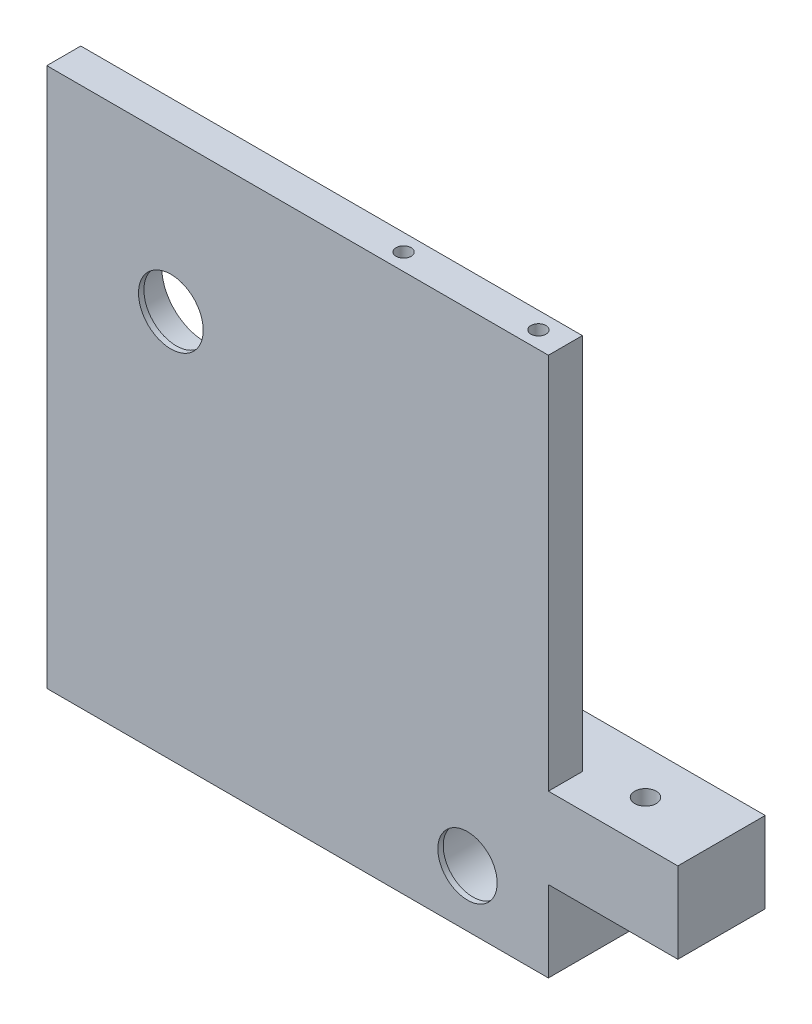
ISO-10303-21;
HEADER;
FILE_DESCRIPTION(('STEP AP214'),'2;1');
FILE_NAME('part.step','',(''),(''),'','','');
FILE_SCHEMA(('AUTOMOTIVE_DESIGN { 1 0 10303 214 1 1 1 1 }'));
ENDSEC;
DATA;
#1=APPLICATION_CONTEXT('core data for automotive mechanical design processes');
#2=APPLICATION_PROTOCOL_DEFINITION('international standard','automotive_design',2000,#1);
#3=PRODUCT_CONTEXT('',#1,'mechanical');
#4=PRODUCT('Part','Part','',(#3));
#5=PRODUCT_RELATED_PRODUCT_CATEGORY('part','',(#4));
#6=PRODUCT_DEFINITION_FORMATION('','',#4);
#7=PRODUCT_DEFINITION_CONTEXT('part definition',#1,'design');
#8=PRODUCT_DEFINITION('design','',#6,#7);
#9=PRODUCT_DEFINITION_SHAPE('','',#8);
#10=(LENGTH_UNIT() NAMED_UNIT(*) SI_UNIT(.MILLI.,.METRE.));
#11=(NAMED_UNIT(*) PLANE_ANGLE_UNIT() SI_UNIT($,.RADIAN.));
#12=(NAMED_UNIT(*) SI_UNIT($,.STERADIAN.) SOLID_ANGLE_UNIT());
#13=UNCERTAINTY_MEASURE_WITH_UNIT(LENGTH_MEASURE(1.E-05),#10,'distance_accuracy_value','');
#14=(GEOMETRIC_REPRESENTATION_CONTEXT(3) GLOBAL_UNCERTAINTY_ASSIGNED_CONTEXT((#13)) GLOBAL_UNIT_ASSIGNED_CONTEXT((#10,
#11,#12)) REPRESENTATION_CONTEXT('',''));
#15=CARTESIAN_POINT('',(0.,0.,0.));
#16=DIRECTION('',(0.,0.,1.));
#17=DIRECTION('',(1.,0.,0.));
#18=AXIS2_PLACEMENT_3D('',#15,#16,#17);
#19=CARTESIAN_POINT('',(1.81294964028777,-24.5719424460432,40.1));
#20=DIRECTION('',(0.,0.,-1.));
#21=DIRECTION('',(-1.,0.,0.));
#22=AXIS2_PLACEMENT_3D('',#19,#20,#21);
#23=CYLINDRICAL_SURFACE('',#22,7.5);
#24=CARTESIAN_POINT('',(1.81294964028777,-24.5719424460432,-9.9));
#25=DIRECTION('',(0.,0.,-1.));
#26=DIRECTION('',(-1.,0.,0.));
#27=AXIS2_PLACEMENT_3D('',#24,#25,#26);
#28=CIRCLE('',#27,7.5);
#29=CARTESIAN_POINT('',(-5.68705035971223,-24.5719424460432,-9.9));
#30=VERTEX_POINT('',#29);
#31=EDGE_CURVE('E305',#30,#30,#28,.T.);
#32=ORIENTED_EDGE('',*,*,#31,.T.);
#33=EDGE_LOOP('',(#32));
#34=FACE_BOUND('',#33,.T.);
#35=CARTESIAN_POINT('',(1.81294964028777,-24.5719424460432,5.3));
#36=DIRECTION('',(0.,0.,1.));
#37=DIRECTION('',(1.,0.,0.));
#38=AXIS2_PLACEMENT_3D('',#35,#36,#37);
#39=CIRCLE('',#38,7.5);
#40=CARTESIAN_POINT('',(9.31294964028777,-24.5719424460432,5.3));
#41=VERTEX_POINT('',#40);
#42=EDGE_CURVE('E14',#41,#41,#39,.F.);
#43=ORIENTED_EDGE('',*,*,#42,.F.);
#44=EDGE_LOOP('',(#43));
#45=FACE_BOUND('',#44,.T.);
#46=ADVANCED_FACE('F62',(#34,#45),#23,.F.);
#47=CARTESIAN_POINT('',(-53.1870503597122,36.9280575539568,50.));
#48=DIRECTION('',(0.,0.,-1.));
#49=DIRECTION('',(-1.,0.,0.));
#50=AXIS2_PLACEMENT_3D('',#47,#48,#49);
#51=CYLINDRICAL_SURFACE('',#50,8.);
#52=CARTESIAN_POINT('',(-53.1870503597122,36.9280575539568,0.));
#53=DIRECTION('',(0.,0.,-1.));
#54=DIRECTION('',(-1.,0.,0.));
#55=AXIS2_PLACEMENT_3D('',#52,#53,#54);
#56=CIRCLE('',#55,8.);
#57=CARTESIAN_POINT('',(-61.1870503597122,36.9280575539568,0.));
#58=VERTEX_POINT('',#57);
#59=EDGE_CURVE('E310',#58,#58,#56,.T.);
#60=ORIENTED_EDGE('',*,*,#59,.T.);
#61=EDGE_LOOP('',(#60));
#62=FACE_BOUND('',#61,.T.);
#63=CARTESIAN_POINT('',(-53.1870503597122,36.9280575539568,5.3));
#64=DIRECTION('',(0.,0.,1.));
#65=DIRECTION('',(1.,0.,0.));
#66=AXIS2_PLACEMENT_3D('',#63,#64,#65);
#67=CIRCLE('',#66,8.);
#68=CARTESIAN_POINT('',(-45.1870503597122,36.9280575539568,5.3));
#69=VERTEX_POINT('',#68);
#70=EDGE_CURVE('E70',#69,#69,#67,.F.);
#71=ORIENTED_EDGE('',*,*,#70,.F.);
#72=EDGE_LOOP('',(#71));
#73=FACE_BOUND('',#72,.T.);
#74=ADVANCED_FACE('F208',(#62,#73),#51,.F.);
#75=CARTESIAN_POINT('',(16.8129496402878,64.9280575539568,6.3));
#76=DIRECTION('',(1.,0.,0.));
#77=DIRECTION('',(0.,1.,0.));
#78=AXIS2_PLACEMENT_3D('',#75,#76,#77);
#79=PLANE('',#78);
#80=DIRECTION('',(0.,-1.,0.));
#81=VECTOR('',#80,1.);
#82=CARTESIAN_POINT('',(16.8129496402878,64.9280575539568,0.));
#83=LINE('',#82,#81);
#84=CARTESIAN_POINT('',(16.8129496402878,64.9280575539568,0.));
#85=VERTEX_POINT('',#84);
#86=CARTESIAN_POINT('',(16.8129496402878,-5.07194244604315,0.));
#87=VERTEX_POINT('',#86);
#88=EDGE_CURVE('E77',#85,#87,#83,.T.);
#89=ORIENTED_EDGE('',*,*,#88,.F.);
#90=DIRECTION('',(0.,0.,-1.));
#91=VECTOR('',#90,1.);
#92=CARTESIAN_POINT('',(16.8129496402878,64.9280575539568,6.3));
#93=LINE('',#92,#91);
#94=CARTESIAN_POINT('',(16.8129496402878,64.9280575539568,6.3));
#95=VERTEX_POINT('',#94);
#96=EDGE_CURVE('E195',#95,#85,#93,.T.);
#97=ORIENTED_EDGE('',*,*,#96,.F.);
#98=DIRECTION('',(0.,-1.,0.));
#99=VECTOR('',#98,1.);
#100=CARTESIAN_POINT('',(16.8129496402878,64.9280575539568,6.3));
#101=LINE('',#100,#99);
#102=CARTESIAN_POINT('',(16.8129496402878,-5.07194244604316,6.3));
#103=VERTEX_POINT('',#102);
#104=EDGE_CURVE('E182',#95,#103,#101,.T.);
#105=ORIENTED_EDGE('',*,*,#104,.T.);
#106=DIRECTION('',(0.,0.,1.));
#107=VECTOR('',#106,1.);
#108=CARTESIAN_POINT('',(16.8129496402878,-5.07194244604315,6.3));
#109=LINE('',#108,#107);
#110=EDGE_CURVE('E287',#87,#103,#109,.T.);
#111=ORIENTED_EDGE('',*,*,#110,.F.);
#112=EDGE_LOOP('',(#89,#97,#105,#111));
#113=FACE_BOUND('',#112,.T.);
#114=ADVANCED_FACE('F210',(#113),#79,.T.);
#115=CARTESIAN_POINT('',(0.,0.,0.));
#116=DIRECTION('',(0.,0.,1.));
#117=DIRECTION('',(1.,0.,0.));
#118=AXIS2_PLACEMENT_3D('',#115,#116,#117);
#119=PLANE('',#118);
#120=ORIENTED_EDGE('',*,*,#59,.F.);
#121=EDGE_LOOP('',(#120));
#122=FACE_BOUND('',#121,.T.);
#123=DIRECTION('',(0.,1.,0.));
#124=VECTOR('',#123,1.);
#125=CARTESIAN_POINT('',(-23.1870503597122,64.9280575539568,0.));
#126=LINE('',#125,#124);
#127=CARTESIAN_POINT('',(-23.1870503597123,-35.0719424460432,0.));
#128=VERTEX_POINT('',#127);
#129=CARTESIAN_POINT('',(-23.1870503597123,-5.07194244604315,0.));
#130=VERTEX_POINT('',#129);
#131=EDGE_CURVE('E152',#128,#130,#126,.T.);
#132=ORIENTED_EDGE('',*,*,#131,.F.);
#133=DIRECTION('',(1.,0.,0.));
#134=VECTOR('',#133,1.);
#135=CARTESIAN_POINT('',(-76.1870503597122,-35.0719424460432,0.));
#136=LINE('',#135,#134);
#137=CARTESIAN_POINT('',(-76.1870503597122,-35.0719424460432,0.));
#138=VERTEX_POINT('',#137);
#139=EDGE_CURVE('E191',#138,#128,#136,.T.);
#140=ORIENTED_EDGE('',*,*,#139,.F.);
#141=DIRECTION('',(0.,-1.,0.));
#142=VECTOR('',#141,1.);
#143=CARTESIAN_POINT('',(-76.1870503597122,64.9280575539568,0.));
#144=LINE('',#143,#142);
#145=CARTESIAN_POINT('',(-76.1870503597122,64.9280575539568,0.));
#146=VERTEX_POINT('',#145);
#147=EDGE_CURVE('E173',#146,#138,#144,.T.);
#148=ORIENTED_EDGE('',*,*,#147,.F.);
#149=DIRECTION('',(1.,0.,0.));
#150=VECTOR('',#149,1.);
#151=CARTESIAN_POINT('',(-76.1870503597122,64.9280575539568,0.));
#152=LINE('',#151,#150);
#153=EDGE_CURVE('E178',#146,#85,#152,.T.);
#154=ORIENTED_EDGE('',*,*,#153,.T.);
#155=ORIENTED_EDGE('',*,*,#88,.T.);
#156=DIRECTION('',(-1.,0.,0.));
#157=VECTOR('',#156,1.);
#158=CARTESIAN_POINT('',(16.8129496402878,-5.07194244604316,0.));
#159=LINE('',#158,#157);
#160=EDGE_CURVE('E141',#87,#130,#159,.T.);
#161=ORIENTED_EDGE('',*,*,#160,.T.);
#162=EDGE_LOOP('',(#132,#140,#148,#154,#155,#161));
#163=FACE_BOUND('',#162,.T.);
#164=ADVANCED_FACE('F151',(#122,#163),#119,.F.);
#165=CARTESIAN_POINT('',(-76.1870503597122,64.9280575539568,6.3));
#166=DIRECTION('',(1.,0.,0.));
#167=DIRECTION('',(0.,0.,-1.));
#168=AXIS2_PLACEMENT_3D('',#165,#166,#167);
#169=PLANE('',#168);
#170=ORIENTED_EDGE('',*,*,#147,.T.);
#171=DIRECTION('',(0.,0.,-1.));
#172=VECTOR('',#171,1.);
#173=CARTESIAN_POINT('',(-76.1870503597122,-35.0719424460432,6.3));
#174=LINE('',#173,#172);
#175=CARTESIAN_POINT('',(-76.1870503597122,-35.0719424460432,6.3));
#176=VERTEX_POINT('',#175);
#177=EDGE_CURVE('E201',#176,#138,#174,.T.);
#178=ORIENTED_EDGE('',*,*,#177,.F.);
#179=DIRECTION('',(0.,-1.,0.));
#180=VECTOR('',#179,1.);
#181=CARTESIAN_POINT('',(-76.1870503597122,64.9280575539568,6.3));
#182=LINE('',#181,#180);
#183=CARTESIAN_POINT('',(-76.1870503597122,64.9280575539568,6.3));
#184=VERTEX_POINT('',#183);
#185=EDGE_CURVE('E174',#184,#176,#182,.T.);
#186=ORIENTED_EDGE('',*,*,#185,.F.);
#187=DIRECTION('',(0.,0.,-1.));
#188=VECTOR('',#187,1.);
#189=CARTESIAN_POINT('',(-76.1870503597122,64.9280575539568,6.3));
#190=LINE('',#189,#188);
#191=EDGE_CURVE('E188',#184,#146,#190,.T.);
#192=ORIENTED_EDGE('',*,*,#191,.T.);
#193=EDGE_LOOP('',(#170,#178,#186,#192));
#194=FACE_BOUND('',#193,.T.);
#195=ADVANCED_FACE('F64',(#194),#169,.F.);
#196=CARTESIAN_POINT('',(-76.1870503597122,-35.0719424460432,6.3));
#197=DIRECTION('',(0.,1.,0.));
#198=DIRECTION('',(0.,0.,1.));
#199=AXIS2_PLACEMENT_3D('',#196,#197,#198);
#200=PLANE('',#199);
#201=ORIENTED_EDGE('',*,*,#139,.T.);
#202=DIRECTION('',(0.,0.,1.));
#203=VECTOR('',#202,1.);
#204=CARTESIAN_POINT('',(-23.1870503597123,-35.0719424460432,-9.9));
#205=LINE('',#204,#203);
#206=CARTESIAN_POINT('',(-23.1870503597123,-35.0719424460432,-9.9));
#207=VERTEX_POINT('',#206);
#208=EDGE_CURVE('E159',#207,#128,#205,.T.);
#209=ORIENTED_EDGE('',*,*,#208,.F.);
#210=DIRECTION('',(-1.,0.,0.));
#211=VECTOR('',#210,1.);
#212=CARTESIAN_POINT('',(16.8129496402877,-35.0719424460432,-9.9));
#213=LINE('',#212,#211);
#214=CARTESIAN_POINT('',(16.8129496402877,-35.0719424460432,-9.9));
#215=VERTEX_POINT('',#214);
#216=EDGE_CURVE('E163',#215,#207,#213,.T.);
#217=ORIENTED_EDGE('',*,*,#216,.F.);
#218=DIRECTION('',(0.,0.,-1.));
#219=VECTOR('',#218,1.);
#220=CARTESIAN_POINT('',(16.8129496402878,-35.0719424460432,6.3));
#221=LINE('',#220,#219);
#222=CARTESIAN_POINT('',(16.8129496402878,-35.0719424460432,6.3));
#223=VERTEX_POINT('',#222);
#224=EDGE_CURVE('E198',#223,#215,#221,.T.);
#225=ORIENTED_EDGE('',*,*,#224,.F.);
#226=DIRECTION('',(1.,0.,0.));
#227=VECTOR('',#226,1.);
#228=CARTESIAN_POINT('',(-76.1870503597122,-35.0719424460432,6.3));
#229=LINE('',#228,#227);
#230=EDGE_CURVE('E177',#176,#223,#229,.T.);
#231=ORIENTED_EDGE('',*,*,#230,.F.);
#232=ORIENTED_EDGE('',*,*,#177,.T.);
#233=EDGE_LOOP('',(#201,#209,#217,#225,#231,#232));
#234=FACE_BOUND('',#233,.T.);
#235=ADVANCED_FACE('F258',(#234),#200,.F.);
#236=DIRECTION('',(0.,0.,-1.));
#237=VECTOR('',#236,1.);
#238=CARTESIAN_POINT('',(16.8129496402878,-20.0719424460432,6.3));
#239=LINE('',#238,#237);
#240=CARTESIAN_POINT('',(16.8129496402878,-20.0719424460432,6.3));
#241=VERTEX_POINT('',#240);
#242=CARTESIAN_POINT('',(16.8129496402878,-20.0719424460432,-9.9));
#243=VERTEX_POINT('',#242);
#244=EDGE_CURVE('E85',#241,#243,#239,.T.);
#245=ORIENTED_EDGE('',*,*,#244,.F.);
#246=EDGE_CURVE('E181',#241,#223,#101,.T.);
#247=ORIENTED_EDGE('',*,*,#246,.T.);
#248=ORIENTED_EDGE('',*,*,#224,.T.);
#249=DIRECTION('',(0.,-1.,0.));
#250=VECTOR('',#249,1.);
#251=CARTESIAN_POINT('',(16.8129496402878,64.9280575539568,-9.9));
#252=LINE('',#251,#250);
#253=EDGE_CURVE('E160',#243,#215,#252,.T.);
#254=ORIENTED_EDGE('',*,*,#253,.F.);
#255=EDGE_LOOP('',(#245,#247,#248,#254));
#256=FACE_BOUND('',#255,.T.);
#257=ADVANCED_FACE('F219',(#256),#79,.T.);
#258=CARTESIAN_POINT('',(-76.1870503597122,64.9280575539568,6.3));
#259=DIRECTION('',(0.,1.,0.));
#260=DIRECTION('',(0.,0.,1.));
#261=AXIS2_PLACEMENT_3D('',#258,#259,#260);
#262=PLANE('',#261);
#263=CARTESIAN_POINT('',(11.8129496402878,64.9280575539568,3.15));
#264=DIRECTION('',(0.,1.,0.));
#265=DIRECTION('',(0.,0.,1.));
#266=AXIS2_PLACEMENT_3D('',#263,#264,#265);
#267=CIRCLE('',#266,1.4);
#268=CARTESIAN_POINT('',(11.8129496402878,64.9280575539568,4.55));
#269=VERTEX_POINT('',#268);
#270=EDGE_CURVE('E331',#269,#269,#267,.T.);
#271=ORIENTED_EDGE('',*,*,#270,.F.);
#272=EDGE_LOOP('',(#271));
#273=FACE_BOUND('',#272,.T.);
#274=CARTESIAN_POINT('',(-13.1870503597122,64.9280575539568,3.15));
#275=DIRECTION('',(0.,1.,0.));
#276=DIRECTION('',(0.,0.,1.));
#277=AXIS2_PLACEMENT_3D('',#274,#275,#276);
#278=CIRCLE('',#277,1.4);
#279=CARTESIAN_POINT('',(-13.1870503597122,64.9280575539568,4.55));
#280=VERTEX_POINT('',#279);
#281=EDGE_CURVE('E325',#280,#280,#278,.T.);
#282=ORIENTED_EDGE('',*,*,#281,.F.);
#283=EDGE_LOOP('',(#282));
#284=FACE_BOUND('',#283,.T.);
#285=ORIENTED_EDGE('',*,*,#96,.T.);
#286=ORIENTED_EDGE('',*,*,#153,.F.);
#287=ORIENTED_EDGE('',*,*,#191,.F.);
#288=DIRECTION('',(1.,0.,0.));
#289=VECTOR('',#288,1.);
#290=CARTESIAN_POINT('',(-76.1870503597122,64.9280575539568,6.3));
#291=LINE('',#290,#289);
#292=EDGE_CURVE('E185',#184,#95,#291,.T.);
#293=ORIENTED_EDGE('',*,*,#292,.T.);
#294=EDGE_LOOP('',(#285,#286,#287,#293));
#295=FACE_BOUND('',#294,.T.);
#296=ADVANCED_FACE('F250',(#273,#284,#295),#262,.T.);
#297=CARTESIAN_POINT('',(0.,0.,6.3));
#298=DIRECTION('',(0.,0.,1.));
#299=DIRECTION('',(1.,0.,0.));
#300=AXIS2_PLACEMENT_3D('',#297,#298,#299);
#301=PLANE('',#300);
#302=ORIENTED_EDGE('',*,*,#185,.T.);
#303=ORIENTED_EDGE('',*,*,#230,.T.);
#304=ORIENTED_EDGE('',*,*,#246,.F.);
#305=DIRECTION('',(-1.,0.,0.));
#306=VECTOR('',#305,1.);
#307=CARTESIAN_POINT('',(40.8129496402878,-20.0719424460432,6.3));
#308=LINE('',#307,#306);
#309=CARTESIAN_POINT('',(40.8129496402878,-20.0719424460432,6.3));
#310=VERTEX_POINT('',#309);
#311=EDGE_CURVE('E161',#310,#241,#308,.T.);
#312=ORIENTED_EDGE('',*,*,#311,.F.);
#313=DIRECTION('',(0.,-1.,0.));
#314=VECTOR('',#313,1.);
#315=CARTESIAN_POINT('',(40.8129496402878,-5.07194244604315,6.3));
#316=LINE('',#315,#314);
#317=CARTESIAN_POINT('',(40.8129496402878,-5.07194244604315,6.3));
#318=VERTEX_POINT('',#317);
#319=EDGE_CURVE('E280',#318,#310,#316,.T.);
#320=ORIENTED_EDGE('',*,*,#319,.F.);
#321=DIRECTION('',(-1.,0.,0.));
#322=VECTOR('',#321,1.);
#323=CARTESIAN_POINT('',(40.8129496402878,-5.07194244604315,6.3));
#324=LINE('',#323,#322);
#325=EDGE_CURVE('E277',#318,#103,#324,.T.);
#326=ORIENTED_EDGE('',*,*,#325,.T.);
#327=ORIENTED_EDGE('',*,*,#104,.F.);
#328=ORIENTED_EDGE('',*,*,#292,.F.);
#329=EDGE_LOOP('',(#302,#303,#304,#312,#320,#326,#327,#328));
#330=FACE_BOUND('',#329,.T.);
#331=CARTESIAN_POINT('',(-53.1870503597122,36.9280575539568,6.3));
#332=DIRECTION('',(0.,0.,1.));
#333=DIRECTION('',(1.,0.,0.));
#334=AXIS2_PLACEMENT_3D('',#331,#332,#333);
#335=CIRCLE('',#334,6.);
#336=CARTESIAN_POINT('',(-47.1870503597122,36.9280575539568,6.3));
#337=VERTEX_POINT('',#336);
#338=EDGE_CURVE('E313',#337,#337,#335,.T.);
#339=ORIENTED_EDGE('',*,*,#338,.F.);
#340=EDGE_LOOP('',(#339));
#341=FACE_BOUND('',#340,.T.);
#342=CARTESIAN_POINT('',(1.81294964028777,-24.5719424460432,6.3));
#343=DIRECTION('',(0.,0.,1.));
#344=DIRECTION('',(1.,0.,0.));
#345=AXIS2_PLACEMENT_3D('',#342,#343,#344);
#346=CIRCLE('',#345,5.5);
#347=CARTESIAN_POINT('',(7.31294964028777,-24.5719424460432,6.3));
#348=VERTEX_POINT('',#347);
#349=EDGE_CURVE('E319',#348,#348,#346,.T.);
#350=ORIENTED_EDGE('',*,*,#349,.F.);
#351=EDGE_LOOP('',(#350));
#352=FACE_BOUND('',#351,.T.);
#353=ADVANCED_FACE('F247',(#330,#341,#352),#301,.T.);
#354=CARTESIAN_POINT('',(-23.1870503597122,64.9280575539568,-9.9));
#355=DIRECTION('',(1.,0.,0.));
#356=DIRECTION('',(0.,1.,0.));
#357=AXIS2_PLACEMENT_3D('',#354,#355,#356);
#358=PLANE('',#357);
#359=ORIENTED_EDGE('',*,*,#131,.T.);
#360=DIRECTION('',(0.,0.,-1.));
#361=VECTOR('',#360,1.);
#362=CARTESIAN_POINT('',(-23.1870503597123,-5.07194244604315,80.6225774829855));
#363=LINE('',#362,#361);
#364=CARTESIAN_POINT('',(-23.1870503597123,-5.07194244604315,-9.9));
#365=VERTEX_POINT('',#364);
#366=EDGE_CURVE('E139',#130,#365,#363,.T.);
#367=ORIENTED_EDGE('',*,*,#366,.T.);
#368=DIRECTION('',(0.,1.,0.));
#369=VECTOR('',#368,1.);
#370=CARTESIAN_POINT('',(-23.1870503597122,64.9280575539568,-9.9));
#371=LINE('',#370,#369);
#372=EDGE_CURVE('E170',#207,#365,#371,.T.);
#373=ORIENTED_EDGE('',*,*,#372,.F.);
#374=ORIENTED_EDGE('',*,*,#208,.T.);
#375=EDGE_LOOP('',(#359,#367,#373,#374));
#376=FACE_BOUND('',#375,.T.);
#377=ADVANCED_FACE('F157',(#376),#358,.F.);
#378=CARTESIAN_POINT('',(0.,0.,-9.9));
#379=DIRECTION('',(0.,0.,-1.));
#380=DIRECTION('',(-1.,0.,0.));
#381=AXIS2_PLACEMENT_3D('',#378,#379,#380);
#382=PLANE('',#381);
#383=ORIENTED_EDGE('',*,*,#372,.T.);
#384=DIRECTION('',(-1.,0.,0.));
#385=VECTOR('',#384,1.);
#386=CARTESIAN_POINT('',(40.8129496402878,-5.07194244604315,-9.9));
#387=LINE('',#386,#385);
#388=CARTESIAN_POINT('',(40.8129496402878,-5.07194244604315,-9.9));
#389=VERTEX_POINT('',#388);
#390=EDGE_CURVE('E145',#389,#365,#387,.T.);
#391=ORIENTED_EDGE('',*,*,#390,.F.);
#392=DIRECTION('',(0.,1.,0.));
#393=VECTOR('',#392,1.);
#394=CARTESIAN_POINT('',(40.8129496402878,-5.07194244604315,-9.9));
#395=LINE('',#394,#393);
#396=CARTESIAN_POINT('',(40.8129496402878,-20.0719424460432,-9.9));
#397=VERTEX_POINT('',#396);
#398=EDGE_CURVE('E284',#397,#389,#395,.T.);
#399=ORIENTED_EDGE('',*,*,#398,.F.);
#400=DIRECTION('',(-1.,0.,0.));
#401=VECTOR('',#400,1.);
#402=CARTESIAN_POINT('',(40.8129496402878,-20.0719424460432,-9.9));
#403=LINE('',#402,#401);
#404=EDGE_CURVE('E166',#397,#243,#403,.T.);
#405=ORIENTED_EDGE('',*,*,#404,.T.);
#406=ORIENTED_EDGE('',*,*,#253,.T.);
#407=ORIENTED_EDGE('',*,*,#216,.T.);
#408=EDGE_LOOP('',(#383,#391,#399,#405,#406,#407));
#409=FACE_BOUND('',#408,.T.);
#410=ORIENTED_EDGE('',*,*,#31,.F.);
#411=EDGE_LOOP('',(#410));
#412=FACE_BOUND('',#411,.T.);
#413=ADVANCED_FACE('F240',(#409,#412),#382,.T.);
#414=CARTESIAN_POINT('',(40.8129496402878,-20.0719424460432,6.3));
#415=DIRECTION('',(0.,1.,0.));
#416=DIRECTION('',(-1.,0.,0.));
#417=AXIS2_PLACEMENT_3D('',#414,#415,#416);
#418=PLANE('',#417);
#419=CARTESIAN_POINT('',(26.8129496402877,-20.0719424460432,-1.7));
#420=DIRECTION('',(0.,1.,0.));
#421=DIRECTION('',(-1.,0.,0.));
#422=AXIS2_PLACEMENT_3D('',#419,#420,#421);
#423=CIRCLE('',#422,2.);
#424=CARTESIAN_POINT('',(24.8129496402878,-20.0719424460432,-1.7));
#425=VERTEX_POINT('',#424);
#426=EDGE_CURVE('E298',#425,#425,#423,.T.);
#427=ORIENTED_EDGE('',*,*,#426,.T.);
#428=EDGE_LOOP('',(#427));
#429=FACE_BOUND('',#428,.T.);
#430=ORIENTED_EDGE('',*,*,#244,.T.);
#431=ORIENTED_EDGE('',*,*,#404,.F.);
#432=DIRECTION('',(0.,0.,-1.));
#433=VECTOR('',#432,1.);
#434=CARTESIAN_POINT('',(40.8129496402878,-20.0719424460432,6.3));
#435=LINE('',#434,#433);
#436=EDGE_CURVE('E293',#310,#397,#435,.T.);
#437=ORIENTED_EDGE('',*,*,#436,.F.);
#438=ORIENTED_EDGE('',*,*,#311,.T.);
#439=EDGE_LOOP('',(#430,#431,#437,#438));
#440=FACE_BOUND('',#439,.T.);
#441=ADVANCED_FACE('F236',(#429,#440),#418,.F.);
#442=CARTESIAN_POINT('',(40.8129496402878,-5.07194244604315,6.3));
#443=DIRECTION('',(0.,-1.,0.));
#444=DIRECTION('',(1.,0.,0.));
#445=AXIS2_PLACEMENT_3D('',#442,#443,#444);
#446=PLANE('',#445);
#447=CARTESIAN_POINT('',(26.8129496402877,-5.07194244604315,-1.7));
#448=DIRECTION('',(0.,1.,0.));
#449=DIRECTION('',(-1.,0.,0.));
#450=AXIS2_PLACEMENT_3D('',#447,#448,#449);
#451=CIRCLE('',#450,2.);
#452=CARTESIAN_POINT('',(24.8129496402878,-5.07194244604315,-1.7));
#453=VERTEX_POINT('',#452);
#454=EDGE_CURVE('E301',#453,#453,#451,.T.);
#455=ORIENTED_EDGE('',*,*,#454,.F.);
#456=EDGE_LOOP('',(#455));
#457=FACE_BOUND('',#456,.T.);
#458=ORIENTED_EDGE('',*,*,#390,.T.);
#459=ORIENTED_EDGE('',*,*,#366,.F.);
#460=ORIENTED_EDGE('',*,*,#160,.F.);
#461=ORIENTED_EDGE('',*,*,#110,.T.);
#462=ORIENTED_EDGE('',*,*,#325,.F.);
#463=DIRECTION('',(0.,0.,1.));
#464=VECTOR('',#463,1.);
#465=CARTESIAN_POINT('',(40.8129496402878,-5.07194244604315,6.3));
#466=LINE('',#465,#464);
#467=EDGE_CURVE('E281',#389,#318,#466,.T.);
#468=ORIENTED_EDGE('',*,*,#467,.F.);
#469=EDGE_LOOP('',(#458,#459,#460,#461,#462,#468));
#470=FACE_BOUND('',#469,.T.);
#471=ADVANCED_FACE('F140',(#457,#470),#446,.F.);
#472=CARTESIAN_POINT('',(40.8129496402878,0.,0.));
#473=DIRECTION('',(1.,0.,0.));
#474=DIRECTION('',(0.,0.,-1.));
#475=AXIS2_PLACEMENT_3D('',#472,#473,#474);
#476=PLANE('',#475);
#477=ORIENTED_EDGE('',*,*,#319,.T.);
#478=ORIENTED_EDGE('',*,*,#436,.T.);
#479=ORIENTED_EDGE('',*,*,#398,.T.);
#480=ORIENTED_EDGE('',*,*,#467,.T.);
#481=EDGE_LOOP('',(#477,#478,#479,#480));
#482=FACE_BOUND('',#481,.T.);
#483=ADVANCED_FACE('F229',(#482),#476,.T.);
#484=CARTESIAN_POINT('',(26.8129496402878,-55.0719424460432,-1.7));
#485=DIRECTION('',(0.,1.,0.));
#486=DIRECTION('',(-1.,0.,0.));
#487=AXIS2_PLACEMENT_3D('',#484,#485,#486);
#488=CYLINDRICAL_SURFACE('',#487,2.);
#489=ORIENTED_EDGE('',*,*,#454,.T.);
#490=EDGE_LOOP('',(#489));
#491=FACE_BOUND('',#490,.T.);
#492=ORIENTED_EDGE('',*,*,#426,.F.);
#493=EDGE_LOOP('',(#492));
#494=FACE_BOUND('',#493,.T.);
#495=ADVANCED_FACE('F226',(#491,#494),#488,.F.);
#496=CARTESIAN_POINT('',(-53.1870503597122,36.9280575539568,5.3));
#497=DIRECTION('',(0.,0.,1.));
#498=DIRECTION('',(1.,0.,0.));
#499=AXIS2_PLACEMENT_3D('',#496,#497,#498);
#500=PLANE('',#499);
#501=CARTESIAN_POINT('',(-53.1870503597122,36.9280575539568,5.3));
#502=DIRECTION('',(0.,0.,1.));
#503=DIRECTION('',(1.,0.,0.));
#504=AXIS2_PLACEMENT_3D('',#501,#502,#503);
#505=CIRCLE('',#504,6.);
#506=CARTESIAN_POINT('',(-47.1870503597122,36.9280575539568,5.3));
#507=VERTEX_POINT('',#506);
#508=EDGE_CURVE('E312',#507,#507,#505,.T.);
#509=ORIENTED_EDGE('',*,*,#508,.T.);
#510=EDGE_LOOP('',(#509));
#511=FACE_BOUND('',#510,.T.);
#512=ORIENTED_EDGE('',*,*,#70,.T.);
#513=EDGE_LOOP('',(#512));
#514=FACE_BOUND('',#513,.T.);
#515=ADVANCED_FACE('F206',(#511,#514),#500,.F.);
#516=CARTESIAN_POINT('',(-53.1870503597122,36.9280575539568,5.3));
#517=DIRECTION('',(0.,0.,1.));
#518=DIRECTION('',(1.,0.,0.));
#519=AXIS2_PLACEMENT_3D('',#516,#517,#518);
#520=CYLINDRICAL_SURFACE('',#519,6.);
#521=ORIENTED_EDGE('',*,*,#508,.F.);
#522=EDGE_LOOP('',(#521));
#523=FACE_BOUND('',#522,.T.);
#524=ORIENTED_EDGE('',*,*,#338,.T.);
#525=EDGE_LOOP('',(#524));
#526=FACE_BOUND('',#525,.T.);
#527=ADVANCED_FACE('F365',(#523,#526),#520,.F.);
#528=CARTESIAN_POINT('',(1.81294964028777,-24.5719424460432,5.3));
#529=DIRECTION('',(0.,0.,1.));
#530=DIRECTION('',(1.,0.,0.));
#531=AXIS2_PLACEMENT_3D('',#528,#529,#530);
#532=PLANE('',#531);
#533=CARTESIAN_POINT('',(1.81294964028777,-24.5719424460432,5.3));
#534=DIRECTION('',(0.,0.,1.));
#535=DIRECTION('',(1.,0.,0.));
#536=AXIS2_PLACEMENT_3D('',#533,#534,#535);
#537=CIRCLE('',#536,5.5);
#538=CARTESIAN_POINT('',(7.31294964028777,-24.5719424460432,5.3));
#539=VERTEX_POINT('',#538);
#540=EDGE_CURVE('E316',#539,#539,#537,.T.);
#541=ORIENTED_EDGE('',*,*,#540,.T.);
#542=EDGE_LOOP('',(#541));
#543=FACE_BOUND('',#542,.T.);
#544=ORIENTED_EDGE('',*,*,#42,.T.);
#545=EDGE_LOOP('',(#544));
#546=FACE_BOUND('',#545,.T.);
#547=ADVANCED_FACE('F359',(#543,#546),#532,.F.);
#548=CARTESIAN_POINT('',(1.81294964028777,-24.5719424460432,5.3));
#549=DIRECTION('',(0.,0.,1.));
#550=DIRECTION('',(1.,0.,0.));
#551=AXIS2_PLACEMENT_3D('',#548,#549,#550);
#552=CYLINDRICAL_SURFACE('',#551,5.5);
#553=ORIENTED_EDGE('',*,*,#540,.F.);
#554=EDGE_LOOP('',(#553));
#555=FACE_BOUND('',#554,.T.);
#556=ORIENTED_EDGE('',*,*,#349,.T.);
#557=EDGE_LOOP('',(#556));
#558=FACE_BOUND('',#557,.T.);
#559=ADVANCED_FACE('F350',(#555,#558),#552,.F.);
#560=CARTESIAN_POINT('',(-13.1870503597122,49.9280575539568,3.15));
#561=DIRECTION('',(0.,1.,0.));
#562=DIRECTION('',(0.,0.,1.));
#563=AXIS2_PLACEMENT_3D('',#560,#561,#562);
#564=CYLINDRICAL_SURFACE('',#563,1.4);
#565=CARTESIAN_POINT('',(-13.1870503597122,49.9280575539568,3.15));
#566=DIRECTION('',(0.,1.,0.));
#567=DIRECTION('',(0.,0.,1.));
#568=AXIS2_PLACEMENT_3D('',#565,#566,#567);
#569=CIRCLE('',#568,1.4);
#570=CARTESIAN_POINT('',(-13.1870503597122,49.9280575539568,4.55));
#571=VERTEX_POINT('',#570);
#572=EDGE_CURVE('E328',#571,#571,#569,.T.);
#573=ORIENTED_EDGE('',*,*,#572,.F.);
#574=EDGE_LOOP('',(#573));
#575=FACE_BOUND('',#574,.T.);
#576=ORIENTED_EDGE('',*,*,#281,.T.);
#577=EDGE_LOOP('',(#576));
#578=FACE_BOUND('',#577,.T.);
#579=ADVANCED_FACE('F348',(#575,#578),#564,.F.);
#580=CARTESIAN_POINT('',(-13.1870503597122,49.9280575539568,3.15));
#581=DIRECTION('',(0.,1.,0.));
#582=DIRECTION('',(0.,0.,1.));
#583=AXIS2_PLACEMENT_3D('',#580,#581,#582);
#584=PLANE('',#583);
#585=ORIENTED_EDGE('',*,*,#572,.T.);
#586=EDGE_LOOP('',(#585));
#587=FACE_BOUND('',#586,.T.);
#588=ADVANCED_FACE('F342',(#587),#584,.T.);
#589=CARTESIAN_POINT('',(11.8129496402878,49.9280575539568,3.15));
#590=DIRECTION('',(0.,1.,0.));
#591=DIRECTION('',(0.,0.,1.));
#592=AXIS2_PLACEMENT_3D('',#589,#590,#591);
#593=CYLINDRICAL_SURFACE('',#592,1.4);
#594=CARTESIAN_POINT('',(11.8129496402878,49.9280575539568,3.15));
#595=DIRECTION('',(0.,1.,0.));
#596=DIRECTION('',(0.,0.,1.));
#597=AXIS2_PLACEMENT_3D('',#594,#595,#596);
#598=CIRCLE('',#597,1.4);
#599=CARTESIAN_POINT('',(11.8129496402878,49.9280575539568,4.55));
#600=VERTEX_POINT('',#599);
#601=EDGE_CURVE('E154',#600,#600,#598,.T.);
#602=ORIENTED_EDGE('',*,*,#601,.F.);
#603=EDGE_LOOP('',(#602));
#604=FACE_BOUND('',#603,.T.);
#605=ORIENTED_EDGE('',*,*,#270,.T.);
#606=EDGE_LOOP('',(#605));
#607=FACE_BOUND('',#606,.T.);
#608=ADVANCED_FACE('F339',(#604,#607),#593,.F.);
#609=CARTESIAN_POINT('',(11.8129496402878,49.9280575539568,3.15));
#610=DIRECTION('',(0.,1.,0.));
#611=DIRECTION('',(0.,0.,1.));
#612=AXIS2_PLACEMENT_3D('',#609,#610,#611);
#613=PLANE('',#612);
#614=ORIENTED_EDGE('',*,*,#601,.T.);
#615=EDGE_LOOP('',(#614));
#616=FACE_BOUND('',#615,.T.);
#617=ADVANCED_FACE('F337',(#616),#613,.T.);
#618=CLOSED_SHELL('',(#46,#74,#114,#164,#195,#235,#257,#296,#353,#377,#413,#441,#471,#483,#495,
#515,#527,#547,#559,#579,#588,#608,#617));
#619=MANIFOLD_SOLID_BREP('B2',#618);
#620=ADVANCED_BREP_SHAPE_REPRESENTATION('',(#18,#619),#14);
#621=SHAPE_DEFINITION_REPRESENTATION(#9,#620);
ENDSEC;
END-ISO-10303-21;
